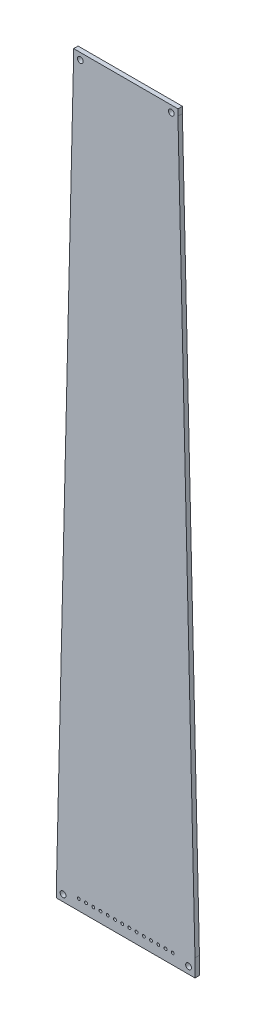
ISO-10303-21;
HEADER;
FILE_DESCRIPTION(('STEP AP214'),'2;1');
FILE_NAME('part.step','',(''),(''),'','','');
FILE_SCHEMA(('AUTOMOTIVE_DESIGN { 1 0 10303 214 1 1 1 1 }'));
ENDSEC;
DATA;
#1=APPLICATION_CONTEXT('core data for automotive mechanical design processes');
#2=APPLICATION_PROTOCOL_DEFINITION('international standard','automotive_design',2000,#1);
#3=PRODUCT_CONTEXT('',#1,'mechanical');
#4=PRODUCT('Part','Part','',(#3));
#5=PRODUCT_RELATED_PRODUCT_CATEGORY('part','',(#4));
#6=PRODUCT_DEFINITION_FORMATION('','',#4);
#7=PRODUCT_DEFINITION_CONTEXT('part definition',#1,'design');
#8=PRODUCT_DEFINITION('design','',#6,#7);
#9=PRODUCT_DEFINITION_SHAPE('','',#8);
#10=(LENGTH_UNIT() NAMED_UNIT(*) SI_UNIT(.MILLI.,.METRE.));
#11=(NAMED_UNIT(*) PLANE_ANGLE_UNIT() SI_UNIT($,.RADIAN.));
#12=(NAMED_UNIT(*) SI_UNIT($,.STERADIAN.) SOLID_ANGLE_UNIT());
#13=UNCERTAINTY_MEASURE_WITH_UNIT(LENGTH_MEASURE(1.E-05),#10,'distance_accuracy_value','');
#14=(GEOMETRIC_REPRESENTATION_CONTEXT(3) GLOBAL_UNCERTAINTY_ASSIGNED_CONTEXT((#13)) GLOBAL_UNIT_ASSIGNED_CONTEXT((#10,
#11,#12)) REPRESENTATION_CONTEXT('',''));
#15=CARTESIAN_POINT('',(0.,0.,0.));
#16=DIRECTION('',(0.,0.,1.));
#17=DIRECTION('',(1.,0.,0.));
#18=AXIS2_PLACEMENT_3D('',#15,#16,#17);
#19=CARTESIAN_POINT('',(7.307507200419E-07,-4.436456342402,1.538354076708));
#20=DIRECTION('',(0.,0.,-1.));
#21=DIRECTION('',(0.,-1.,0.));
#22=AXIS2_PLACEMENT_3D('',#19,#20,#21);
#23=PLANE('',#22);
#24=CARTESIAN_POINT('',(21.717043434087,-128.2702565405,1.538354076708));
#25=DIRECTION('',(0.,0.,1.));
#26=DIRECTION('',(1.,0.,0.));
#27=AXIS2_PLACEMENT_3D('',#24,#25,#26);
#28=CIRCLE('',#27,1.000002540005);
#29=CARTESIAN_POINT('',(22.717045974092,-128.2702565405,1.538354076708));
#30=VERTEX_POINT('',#29);
#31=EDGE_CURVE('E27',#30,#30,#28,.T.);
#32=ORIENTED_EDGE('',*,*,#31,.F.);
#33=EDGE_LOOP('',(#32));
#34=FACE_BOUND('',#33,.T.);
#35=CARTESIAN_POINT('',(16.249911099822,-127.0002286004,1.538354076708));
#36=DIRECTION('',(0.,0.,1.));
#37=DIRECTION('',(1.,0.,0.));
#38=AXIS2_PLACEMENT_3D('',#35,#36,#37);
#39=CIRCLE('',#38,0.5);
#40=CARTESIAN_POINT('',(16.749911099822,-127.0002286004,1.538354076708));
#41=VERTEX_POINT('',#40);
#42=EDGE_CURVE('E186',#41,#41,#39,.T.);
#43=ORIENTED_EDGE('',*,*,#42,.F.);
#44=EDGE_LOOP('',(#43));
#45=FACE_BOUND('',#44,.T.);
#46=CARTESIAN_POINT('',(15.748031496063,124.58724917449,1.538354076708));
#47=DIRECTION('',(0.,0.,1.));
#48=DIRECTION('',(1.,0.,0.));
#49=AXIS2_PLACEMENT_3D('',#46,#47,#48);
#50=CIRCLE('',#49,1.000002540005);
#51=CARTESIAN_POINT('',(16.748034036068,124.58724917449,1.538354076708));
#52=VERTEX_POINT('',#51);
#53=EDGE_CURVE('E187',#52,#52,#50,.T.);
#54=ORIENTED_EDGE('',*,*,#53,.F.);
#55=EDGE_LOOP('',(#54));
#56=FACE_BOUND('',#55,.T.);
#57=CARTESIAN_POINT('',(13.750038100076,-127.0002286004,1.538354076708));
#58=DIRECTION('',(0.,0.,1.));
#59=DIRECTION('',(1.,0.,0.));
#60=AXIS2_PLACEMENT_3D('',#57,#58,#59);
#61=CIRCLE('',#60,0.5);
#62=CARTESIAN_POINT('',(14.250038100076,-127.0002286004,1.538354076708));
#63=VERTEX_POINT('',#62);
#64=EDGE_CURVE('E270',#63,#63,#61,.T.);
#65=ORIENTED_EDGE('',*,*,#64,.F.);
#66=EDGE_LOOP('',(#65));
#67=FACE_BOUND('',#66,.T.);
#68=CARTESIAN_POINT('',(11.250038100076,-127.0002286004,1.538354076708));
#69=DIRECTION('',(0.,0.,1.));
#70=DIRECTION('',(1.,0.,0.));
#71=AXIS2_PLACEMENT_3D('',#68,#69,#70);
#72=CIRCLE('',#71,0.5);
#73=CARTESIAN_POINT('',(11.750038100076,-127.0002286004,1.538354076708));
#74=VERTEX_POINT('',#73);
#75=EDGE_CURVE('E333',#74,#74,#72,.T.);
#76=ORIENTED_EDGE('',*,*,#75,.F.);
#77=EDGE_LOOP('',(#76));
#78=FACE_BOUND('',#77,.T.);
#79=CARTESIAN_POINT('',(8.750038100076,-127.0002286004,1.538354076708));
#80=DIRECTION('',(0.,0.,1.));
#81=DIRECTION('',(1.,0.,0.));
#82=AXIS2_PLACEMENT_3D('',#79,#80,#81);
#83=CIRCLE('',#82,0.5);
#84=CARTESIAN_POINT('',(9.250038100076,-127.0002286004,1.538354076708));
#85=VERTEX_POINT('',#84);
#86=EDGE_CURVE('E325',#85,#85,#83,.T.);
#87=ORIENTED_EDGE('',*,*,#86,.F.);
#88=EDGE_LOOP('',(#87));
#89=FACE_BOUND('',#88,.T.);
#90=CARTESIAN_POINT('',(6.250038100076,-127.0002286004,1.538354076708));
#91=DIRECTION('',(0.,0.,1.));
#92=DIRECTION('',(1.,0.,0.));
#93=AXIS2_PLACEMENT_3D('',#90,#91,#92);
#94=CIRCLE('',#93,0.5);
#95=CARTESIAN_POINT('',(6.750038100076,-127.0002286004,1.538354076708));
#96=VERTEX_POINT('',#95);
#97=EDGE_CURVE('E317',#96,#96,#94,.T.);
#98=ORIENTED_EDGE('',*,*,#97,.F.);
#99=EDGE_LOOP('',(#98));
#100=FACE_BOUND('',#99,.T.);
#101=CARTESIAN_POINT('',(3.750038100076,-127.0002286004,1.538354076708));
#102=DIRECTION('',(0.,0.,1.));
#103=DIRECTION('',(1.,0.,0.));
#104=AXIS2_PLACEMENT_3D('',#101,#102,#103);
#105=CIRCLE('',#104,0.5);
#106=CARTESIAN_POINT('',(4.250038100076,-127.0002286004,1.538354076708));
#107=VERTEX_POINT('',#106);
#108=EDGE_CURVE('E309',#107,#107,#105,.T.);
#109=ORIENTED_EDGE('',*,*,#108,.F.);
#110=EDGE_LOOP('',(#109));
#111=FACE_BOUND('',#110,.T.);
#112=CARTESIAN_POINT('',(1.250038100076,-127.0002286004,1.538354076708));
#113=DIRECTION('',(0.,0.,1.));
#114=DIRECTION('',(1.,0.,0.));
#115=AXIS2_PLACEMENT_3D('',#112,#113,#114);
#116=CIRCLE('',#115,0.5);
#117=CARTESIAN_POINT('',(1.750038100076,-127.0002286004,1.538354076708));
#118=VERTEX_POINT('',#117);
#119=EDGE_CURVE('E298',#118,#118,#116,.T.);
#120=ORIENTED_EDGE('',*,*,#119,.F.);
#121=EDGE_LOOP('',(#120));
#122=FACE_BOUND('',#121,.T.);
#123=CARTESIAN_POINT('',(-1.249961899924,-127.0002286004,1.538354076708));
#124=DIRECTION('',(0.,0.,1.));
#125=DIRECTION('',(1.,0.,0.));
#126=AXIS2_PLACEMENT_3D('',#123,#124,#125);
#127=CIRCLE('',#126,0.5);
#128=CARTESIAN_POINT('',(-0.749961899924,-127.0002286004,1.538354076708));
#129=VERTEX_POINT('',#128);
#130=EDGE_CURVE('E262',#129,#129,#127,.T.);
#131=ORIENTED_EDGE('',*,*,#130,.F.);
#132=EDGE_LOOP('',(#131));
#133=FACE_BOUND('',#132,.T.);
#134=CARTESIAN_POINT('',(-3.749961899924,-127.0002286004,1.538354076708));
#135=DIRECTION('',(0.,0.,1.));
#136=DIRECTION('',(1.,0.,0.));
#137=AXIS2_PLACEMENT_3D('',#134,#135,#136);
#138=CIRCLE('',#137,0.5);
#139=CARTESIAN_POINT('',(-3.249961899924,-127.0002286004,1.538354076708));
#140=VERTEX_POINT('',#139);
#141=EDGE_CURVE('E263',#140,#140,#138,.T.);
#142=ORIENTED_EDGE('',*,*,#141,.F.);
#143=EDGE_LOOP('',(#142));
#144=FACE_BOUND('',#143,.T.);
#145=CARTESIAN_POINT('',(-6.249961899924,-127.0002286004,1.538354076708));
#146=DIRECTION('',(0.,0.,1.));
#147=DIRECTION('',(1.,0.,0.));
#148=AXIS2_PLACEMENT_3D('',#145,#146,#147);
#149=CIRCLE('',#148,0.5);
#150=CARTESIAN_POINT('',(-5.749961899924,-127.0002286004,1.538354076708));
#151=VERTEX_POINT('',#150);
#152=EDGE_CURVE('E240',#151,#151,#149,.T.);
#153=ORIENTED_EDGE('',*,*,#152,.F.);
#154=EDGE_LOOP('',(#153));
#155=FACE_BOUND('',#154,.T.);
#156=CARTESIAN_POINT('',(-8.749961899924,-127.0002286004,1.538354076708));
#157=DIRECTION('',(0.,0.,1.));
#158=DIRECTION('',(1.,0.,0.));
#159=AXIS2_PLACEMENT_3D('',#156,#157,#158);
#160=CIRCLE('',#159,0.5);
#161=CARTESIAN_POINT('',(-8.249961899924,-127.0002286004,1.538354076708));
#162=VERTEX_POINT('',#161);
#163=EDGE_CURVE('E204',#162,#162,#160,.T.);
#164=ORIENTED_EDGE('',*,*,#163,.F.);
#165=EDGE_LOOP('',(#164));
#166=FACE_BOUND('',#165,.T.);
#167=CARTESIAN_POINT('',(-11.24996189992,-127.0002286004,1.538354076708));
#168=DIRECTION('',(0.,0.,1.));
#169=DIRECTION('',(1.,0.,0.));
#170=AXIS2_PLACEMENT_3D('',#167,#168,#169);
#171=CIRCLE('',#170,0.5);
#172=CARTESIAN_POINT('',(-10.74996189992,-127.0002286004,1.538354076708));
#173=VERTEX_POINT('',#172);
#174=EDGE_CURVE('E171',#173,#173,#171,.T.);
#175=ORIENTED_EDGE('',*,*,#174,.F.);
#176=EDGE_LOOP('',(#175));
#177=FACE_BOUND('',#176,.T.);
#178=CARTESIAN_POINT('',(-13.74996189992,-127.0002286004,1.538354076708));
#179=DIRECTION('',(0.,0.,1.));
#180=DIRECTION('',(1.,0.,0.));
#181=AXIS2_PLACEMENT_3D('',#178,#179,#180);
#182=CIRCLE('',#181,0.5);
#183=CARTESIAN_POINT('',(-13.24996189992,-127.0002286004,1.538354076708));
#184=VERTEX_POINT('',#183);
#185=EDGE_CURVE('E193',#184,#184,#182,.T.);
#186=ORIENTED_EDGE('',*,*,#185,.F.);
#187=EDGE_LOOP('',(#186));
#188=FACE_BOUND('',#187,.T.);
#189=CARTESIAN_POINT('',(-15.74803149606,124.58724917449,1.538354076708));
#190=DIRECTION('',(0.,0.,1.));
#191=DIRECTION('',(1.,0.,0.));
#192=AXIS2_PLACEMENT_3D('',#189,#190,#191);
#193=CIRCLE('',#192,1.000002540005);
#194=CARTESIAN_POINT('',(-14.748028956055,124.58724917449,1.538354076708));
#195=VERTEX_POINT('',#194);
#196=EDGE_CURVE('E245',#195,#195,#193,.T.);
#197=ORIENTED_EDGE('',*,*,#196,.F.);
#198=EDGE_LOOP('',(#197));
#199=FACE_BOUND('',#198,.T.);
#200=CARTESIAN_POINT('',(-16.24996189992,-127.0002286004,1.538354076708));
#201=DIRECTION('',(0.,0.,1.));
#202=DIRECTION('',(1.,0.,0.));
#203=AXIS2_PLACEMENT_3D('',#200,#201,#202);
#204=CIRCLE('',#203,0.5);
#205=CARTESIAN_POINT('',(-15.74996189992,-127.0002286004,1.538354076708));
#206=VERTEX_POINT('',#205);
#207=EDGE_CURVE('E253',#206,#206,#204,.T.);
#208=ORIENTED_EDGE('',*,*,#207,.F.);
#209=EDGE_LOOP('',(#208));
#210=FACE_BOUND('',#209,.T.);
#211=CARTESIAN_POINT('',(-21.71704343408,-128.3972567945,1.538354076708));
#212=DIRECTION('',(0.,0.,1.));
#213=DIRECTION('',(1.,0.,0.));
#214=AXIS2_PLACEMENT_3D('',#211,#212,#213);
#215=CIRCLE('',#214,1.000002540005);
#216=CARTESIAN_POINT('',(-20.717040894075,-128.3972567945,1.538354076708));
#217=VERTEX_POINT('',#216);
#218=EDGE_CURVE('E133',#217,#217,#215,.T.);
#219=ORIENTED_EDGE('',*,*,#218,.F.);
#220=EDGE_LOOP('',(#219));
#221=FACE_BOUND('',#220,.T.);
#222=DIRECTION('',(1.60324000959454E-06,0.999999999998715,0.));
#223=VECTOR('',#222,1.);
#224=CARTESIAN_POINT('',(-18.05206348825,124.64994890629,1.538354076708));
#225=LINE('',#224,#223);
#226=CARTESIAN_POINT('',(-18.05206348825,124.64994890629,1.538354076708));
#227=VERTEX_POINT('',#226);
#228=CARTESIAN_POINT('',(-18.05205994412,126.8605537211,1.538354076708));
#229=VERTEX_POINT('',#228);
#230=EDGE_CURVE('E134',#227,#229,#225,.T.);
#231=ORIENTED_EDGE('',*,*,#230,.F.);
#232=DIRECTION('',(0.0236231185664704,0.999720935196015,0.));
#233=VECTOR('',#232,1.);
#234=CARTESIAN_POINT('',(-23.94295910591,-124.6503989485,1.538354076708));
#235=LINE('',#234,#233);
#236=CARTESIAN_POINT('',(-23.94295910591,-124.6503989485,1.538354076708));
#237=VERTEX_POINT('',#236);
#238=EDGE_CURVE('E222',#237,#227,#235,.T.);
#239=ORIENTED_EDGE('',*,*,#238,.F.);
#240=DIRECTION('',(0.,1.,0.));
#241=VECTOR('',#240,1.);
#242=CARTESIAN_POINT('',(-23.94295910591,-130.6705613411,1.538354076708));
#243=LINE('',#242,#241);
#244=CARTESIAN_POINT('',(-23.94295910591,-130.6705613411,1.538354076708));
#245=VERTEX_POINT('',#244);
#246=EDGE_CURVE('E78',#245,#237,#243,.T.);
#247=ORIENTED_EDGE('',*,*,#246,.F.);
#248=DIRECTION('',(-1.,0.,0.));
#249=VECTOR('',#248,1.);
#250=CARTESIAN_POINT('',(23.942959105918,-130.6705613411,1.538354076708));
#251=LINE('',#250,#249);
#252=CARTESIAN_POINT('',(23.942959105918,-130.6705613411,1.538354076708));
#253=VERTEX_POINT('',#252);
#254=EDGE_CURVE('E190',#253,#245,#251,.T.);
#255=ORIENTED_EDGE('',*,*,#254,.F.);
#256=DIRECTION('',(0.,-1.,0.));
#257=VECTOR('',#256,1.);
#258=CARTESIAN_POINT('',(23.942959105918,-124.6503989485,1.538354076708));
#259=LINE('',#258,#257);
#260=CARTESIAN_POINT('',(23.942959105918,-124.6503989485,1.538354076708));
#261=VERTEX_POINT('',#260);
#262=EDGE_CURVE('E89',#261,#253,#259,.T.);
#263=ORIENTED_EDGE('',*,*,#262,.F.);
#264=DIRECTION('',(0.0236231043581142,-0.999720935531754,0.));
#265=VECTOR('',#264,1.);
#266=CARTESIAN_POINT('',(18.05205994412,124.65024892049,1.538354076708));
#267=LINE('',#266,#265);
#268=CARTESIAN_POINT('',(18.05205994412,124.65024892049,1.538354076708));
#269=VERTEX_POINT('',#268);
#270=EDGE_CURVE('E107',#269,#261,#267,.T.);
#271=ORIENTED_EDGE('',*,*,#270,.F.);
#272=DIRECTION('',(0.,-1.,0.));
#273=VECTOR('',#272,1.);
#274=CARTESIAN_POINT('',(18.05205994412,126.8605537211,1.538354076708));
#275=LINE('',#274,#273);
#276=CARTESIAN_POINT('',(18.05205994412,126.8605537211,1.538354076708));
#277=VERTEX_POINT('',#276);
#278=EDGE_CURVE('E144',#277,#269,#275,.T.);
#279=ORIENTED_EDGE('',*,*,#278,.F.);
#280=DIRECTION('',(1.,0.,0.));
#281=VECTOR('',#280,1.);
#282=CARTESIAN_POINT('',(-18.05205994412,126.8605537211,1.538354076708));
#283=LINE('',#282,#281);
#284=EDGE_CURVE('E149',#229,#277,#283,.T.);
#285=ORIENTED_EDGE('',*,*,#284,.F.);
#286=EDGE_LOOP('',(#231,#239,#247,#255,#263,#271,#279,#285));
#287=FACE_BOUND('',#286,.T.);
#288=ADVANCED_FACE('F17',(#34,#45,#56,#67,#78,#89,#100,#111,#122,#133,#144,#155,#166,#177,#188,
#199,#210,#221,#287),#23,.F.);
#289=CARTESIAN_POINT('',(7.307507200419E-07,-4.436456342402,0.));
#290=DIRECTION('',(0.,0.,-1.));
#291=DIRECTION('',(0.,-1.,0.));
#292=AXIS2_PLACEMENT_3D('',#289,#290,#291);
#293=PLANE('',#292);
#294=CARTESIAN_POINT('',(21.717043434087,-128.2702565405,0.));
#295=DIRECTION('',(0.,0.,1.));
#296=DIRECTION('',(1.,0.,0.));
#297=AXIS2_PLACEMENT_3D('',#294,#295,#296);
#298=CIRCLE('',#297,1.000002540005);
#299=CARTESIAN_POINT('',(22.717045974092,-128.2702565405,0.));
#300=VERTEX_POINT('',#299);
#301=EDGE_CURVE('E10',#300,#300,#298,.T.);
#302=ORIENTED_EDGE('',*,*,#301,.T.);
#303=EDGE_LOOP('',(#302));
#304=FACE_BOUND('',#303,.T.);
#305=CARTESIAN_POINT('',(16.249911099822,-127.0002286004,0.));
#306=DIRECTION('',(0.,0.,1.));
#307=DIRECTION('',(1.,0.,0.));
#308=AXIS2_PLACEMENT_3D('',#305,#306,#307);
#309=CIRCLE('',#308,0.5);
#310=CARTESIAN_POINT('',(16.749911099822,-127.0002286004,0.));
#311=VERTEX_POINT('',#310);
#312=EDGE_CURVE('E20',#311,#311,#309,.T.);
#313=ORIENTED_EDGE('',*,*,#312,.T.);
#314=EDGE_LOOP('',(#313));
#315=FACE_BOUND('',#314,.T.);
#316=CARTESIAN_POINT('',(15.748031496063,124.58724917449,0.));
#317=DIRECTION('',(0.,0.,1.));
#318=DIRECTION('',(1.,0.,0.));
#319=AXIS2_PLACEMENT_3D('',#316,#317,#318);
#320=CIRCLE('',#319,1.000002540005);
#321=CARTESIAN_POINT('',(16.748034036068,124.58724917449,0.));
#322=VERTEX_POINT('',#321);
#323=EDGE_CURVE('E182',#322,#322,#320,.T.);
#324=ORIENTED_EDGE('',*,*,#323,.T.);
#325=EDGE_LOOP('',(#324));
#326=FACE_BOUND('',#325,.T.);
#327=CARTESIAN_POINT('',(13.750038100076,-127.0002286004,0.));
#328=DIRECTION('',(0.,0.,1.));
#329=DIRECTION('',(1.,0.,0.));
#330=AXIS2_PLACEMENT_3D('',#327,#328,#329);
#331=CIRCLE('',#330,0.5);
#332=CARTESIAN_POINT('',(14.250038100076,-127.0002286004,0.));
#333=VERTEX_POINT('',#332);
#334=EDGE_CURVE('E225',#333,#333,#331,.T.);
#335=ORIENTED_EDGE('',*,*,#334,.T.);
#336=EDGE_LOOP('',(#335));
#337=FACE_BOUND('',#336,.T.);
#338=CARTESIAN_POINT('',(11.250038100076,-127.0002286004,0.));
#339=DIRECTION('',(0.,0.,1.));
#340=DIRECTION('',(1.,0.,0.));
#341=AXIS2_PLACEMENT_3D('',#338,#339,#340);
#342=CIRCLE('',#341,0.5);
#343=CARTESIAN_POINT('',(11.750038100076,-127.0002286004,0.));
#344=VERTEX_POINT('',#343);
#345=EDGE_CURVE('E274',#344,#344,#342,.T.);
#346=ORIENTED_EDGE('',*,*,#345,.T.);
#347=EDGE_LOOP('',(#346));
#348=FACE_BOUND('',#347,.T.);
#349=CARTESIAN_POINT('',(8.750038100076,-127.0002286004,0.));
#350=DIRECTION('',(0.,0.,1.));
#351=DIRECTION('',(1.,0.,0.));
#352=AXIS2_PLACEMENT_3D('',#349,#350,#351);
#353=CIRCLE('',#352,0.5);
#354=CARTESIAN_POINT('',(9.250038100076,-127.0002286004,0.));
#355=VERTEX_POINT('',#354);
#356=EDGE_CURVE('E329',#355,#355,#353,.T.);
#357=ORIENTED_EDGE('',*,*,#356,.T.);
#358=EDGE_LOOP('',(#357));
#359=FACE_BOUND('',#358,.T.);
#360=CARTESIAN_POINT('',(6.250038100076,-127.0002286004,0.));
#361=DIRECTION('',(0.,0.,1.));
#362=DIRECTION('',(1.,0.,0.));
#363=AXIS2_PLACEMENT_3D('',#360,#361,#362);
#364=CIRCLE('',#363,0.5);
#365=CARTESIAN_POINT('',(6.750038100076,-127.0002286004,0.));
#366=VERTEX_POINT('',#365);
#367=EDGE_CURVE('E321',#366,#366,#364,.T.);
#368=ORIENTED_EDGE('',*,*,#367,.T.);
#369=EDGE_LOOP('',(#368));
#370=FACE_BOUND('',#369,.T.);
#371=CARTESIAN_POINT('',(3.750038100076,-127.0002286004,0.));
#372=DIRECTION('',(0.,0.,1.));
#373=DIRECTION('',(1.,0.,0.));
#374=AXIS2_PLACEMENT_3D('',#371,#372,#373);
#375=CIRCLE('',#374,0.5);
#376=CARTESIAN_POINT('',(4.250038100076,-127.0002286004,0.));
#377=VERTEX_POINT('',#376);
#378=EDGE_CURVE('E313',#377,#377,#375,.T.);
#379=ORIENTED_EDGE('',*,*,#378,.T.);
#380=EDGE_LOOP('',(#379));
#381=FACE_BOUND('',#380,.T.);
#382=CARTESIAN_POINT('',(1.250038100076,-127.0002286004,0.));
#383=DIRECTION('',(0.,0.,1.));
#384=DIRECTION('',(1.,0.,0.));
#385=AXIS2_PLACEMENT_3D('',#382,#383,#384);
#386=CIRCLE('',#385,0.5);
#387=CARTESIAN_POINT('',(1.750038100076,-127.0002286004,0.));
#388=VERTEX_POINT('',#387);
#389=EDGE_CURVE('E305',#388,#388,#386,.T.);
#390=ORIENTED_EDGE('',*,*,#389,.T.);
#391=EDGE_LOOP('',(#390));
#392=FACE_BOUND('',#391,.T.);
#393=CARTESIAN_POINT('',(-1.249961899924,-127.0002286004,0.));
#394=DIRECTION('',(0.,0.,1.));
#395=DIRECTION('',(1.,0.,0.));
#396=AXIS2_PLACEMENT_3D('',#393,#394,#395);
#397=CIRCLE('',#396,0.5);
#398=CARTESIAN_POINT('',(-0.749961899924,-127.0002286004,0.));
#399=VERTEX_POINT('',#398);
#400=EDGE_CURVE('E281',#399,#399,#397,.T.);
#401=ORIENTED_EDGE('',*,*,#400,.T.);
#402=EDGE_LOOP('',(#401));
#403=FACE_BOUND('',#402,.T.);
#404=CARTESIAN_POINT('',(-3.749961899924,-127.0002286004,0.));
#405=DIRECTION('',(0.,0.,1.));
#406=DIRECTION('',(1.,0.,0.));
#407=AXIS2_PLACEMENT_3D('',#404,#405,#406);
#408=CIRCLE('',#407,0.5);
#409=CARTESIAN_POINT('',(-3.249961899924,-127.0002286004,0.));
#410=VERTEX_POINT('',#409);
#411=EDGE_CURVE('E258',#410,#410,#408,.T.);
#412=ORIENTED_EDGE('',*,*,#411,.T.);
#413=EDGE_LOOP('',(#412));
#414=FACE_BOUND('',#413,.T.);
#415=CARTESIAN_POINT('',(-6.249961899924,-127.0002286004,0.));
#416=DIRECTION('',(0.,0.,1.));
#417=DIRECTION('',(1.,0.,0.));
#418=AXIS2_PLACEMENT_3D('',#415,#416,#417);
#419=CIRCLE('',#418,0.5);
#420=CARTESIAN_POINT('',(-5.749961899924,-127.0002286004,0.));
#421=VERTEX_POINT('',#420);
#422=EDGE_CURVE('E288',#421,#421,#419,.T.);
#423=ORIENTED_EDGE('',*,*,#422,.T.);
#424=EDGE_LOOP('',(#423));
#425=FACE_BOUND('',#424,.T.);
#426=CARTESIAN_POINT('',(-8.749961899924,-127.0002286004,0.));
#427=DIRECTION('',(0.,0.,1.));
#428=DIRECTION('',(1.,0.,0.));
#429=AXIS2_PLACEMENT_3D('',#426,#427,#428);
#430=CIRCLE('',#429,0.5);
#431=CARTESIAN_POINT('',(-8.249961899924,-127.0002286004,0.));
#432=VERTEX_POINT('',#431);
#433=EDGE_CURVE('E237',#432,#432,#430,.T.);
#434=ORIENTED_EDGE('',*,*,#433,.T.);
#435=EDGE_LOOP('',(#434));
#436=FACE_BOUND('',#435,.T.);
#437=CARTESIAN_POINT('',(-11.24996189992,-127.0002286004,0.));
#438=DIRECTION('',(0.,0.,1.));
#439=DIRECTION('',(1.,0.,0.));
#440=AXIS2_PLACEMENT_3D('',#437,#438,#439);
#441=CIRCLE('',#440,0.5);
#442=CARTESIAN_POINT('',(-10.74996189992,-127.0002286004,0.));
#443=VERTEX_POINT('',#442);
#444=EDGE_CURVE('E175',#443,#443,#441,.T.);
#445=ORIENTED_EDGE('',*,*,#444,.T.);
#446=EDGE_LOOP('',(#445));
#447=FACE_BOUND('',#446,.T.);
#448=CARTESIAN_POINT('',(-13.74996189992,-127.0002286004,0.));
#449=DIRECTION('',(0.,0.,1.));
#450=DIRECTION('',(1.,0.,0.));
#451=AXIS2_PLACEMENT_3D('',#448,#449,#450);
#452=CIRCLE('',#451,0.5);
#453=CARTESIAN_POINT('',(-13.24996189992,-127.0002286004,0.));
#454=VERTEX_POINT('',#453);
#455=EDGE_CURVE('E176',#454,#454,#452,.T.);
#456=ORIENTED_EDGE('',*,*,#455,.T.);
#457=EDGE_LOOP('',(#456));
#458=FACE_BOUND('',#457,.T.);
#459=CARTESIAN_POINT('',(-15.74803149606,124.58724917449,0.));
#460=DIRECTION('',(0.,0.,1.));
#461=DIRECTION('',(1.,0.,0.));
#462=AXIS2_PLACEMENT_3D('',#459,#460,#461);
#463=CIRCLE('',#462,1.000002540005);
#464=CARTESIAN_POINT('',(-14.748028956055,124.58724917449,0.));
#465=VERTEX_POINT('',#464);
#466=EDGE_CURVE('E197',#465,#465,#463,.T.);
#467=ORIENTED_EDGE('',*,*,#466,.T.);
#468=EDGE_LOOP('',(#467));
#469=FACE_BOUND('',#468,.T.);
#470=CARTESIAN_POINT('',(-16.24996189992,-127.0002286004,0.));
#471=DIRECTION('',(0.,0.,1.));
#472=DIRECTION('',(1.,0.,0.));
#473=AXIS2_PLACEMENT_3D('',#470,#471,#472);
#474=CIRCLE('',#473,0.5);
#475=CARTESIAN_POINT('',(-15.74996189992,-127.0002286004,0.));
#476=VERTEX_POINT('',#475);
#477=EDGE_CURVE('E257',#476,#476,#474,.T.);
#478=ORIENTED_EDGE('',*,*,#477,.T.);
#479=EDGE_LOOP('',(#478));
#480=FACE_BOUND('',#479,.T.);
#481=CARTESIAN_POINT('',(-21.71704343408,-128.3972567945,0.));
#482=DIRECTION('',(0.,0.,1.));
#483=DIRECTION('',(1.,0.,0.));
#484=AXIS2_PLACEMENT_3D('',#481,#482,#483);
#485=CIRCLE('',#484,1.000002540005);
#486=CARTESIAN_POINT('',(-20.717040894075,-128.3972567945,0.));
#487=VERTEX_POINT('',#486);
#488=EDGE_CURVE('E249',#487,#487,#485,.T.);
#489=ORIENTED_EDGE('',*,*,#488,.T.);
#490=EDGE_LOOP('',(#489));
#491=FACE_BOUND('',#490,.T.);
#492=DIRECTION('',(1.,0.,0.));
#493=VECTOR('',#492,1.);
#494=CARTESIAN_POINT('',(-18.05205994412,126.8605537211,0.));
#495=LINE('',#494,#493);
#496=CARTESIAN_POINT('',(-18.05205994412,126.8605537211,0.));
#497=VERTEX_POINT('',#496);
#498=CARTESIAN_POINT('',(18.05205994412,126.8605537211,0.));
#499=VERTEX_POINT('',#498);
#500=EDGE_CURVE('E127',#497,#499,#495,.T.);
#501=ORIENTED_EDGE('',*,*,#500,.T.);
#502=DIRECTION('',(0.,-1.,0.));
#503=VECTOR('',#502,1.);
#504=CARTESIAN_POINT('',(18.05205994412,126.8605537211,0.));
#505=LINE('',#504,#503);
#506=CARTESIAN_POINT('',(18.05205994412,124.65024892049,0.));
#507=VERTEX_POINT('',#506);
#508=EDGE_CURVE('E165',#499,#507,#505,.T.);
#509=ORIENTED_EDGE('',*,*,#508,.T.);
#510=DIRECTION('',(0.0236231043581142,-0.999720935531754,0.));
#511=VECTOR('',#510,1.);
#512=CARTESIAN_POINT('',(18.05205994412,124.65024892049,0.));
#513=LINE('',#512,#511);
#514=CARTESIAN_POINT('',(23.942959105918,-124.6503989485,0.));
#515=VERTEX_POINT('',#514);
#516=EDGE_CURVE('E100',#507,#515,#513,.T.);
#517=ORIENTED_EDGE('',*,*,#516,.T.);
#518=DIRECTION('',(0.,-1.,0.));
#519=VECTOR('',#518,1.);
#520=CARTESIAN_POINT('',(23.942959105918,-124.6503989485,0.));
#521=LINE('',#520,#519);
#522=CARTESIAN_POINT('',(23.942959105918,-130.6705613411,0.));
#523=VERTEX_POINT('',#522);
#524=EDGE_CURVE('E208',#515,#523,#521,.T.);
#525=ORIENTED_EDGE('',*,*,#524,.T.);
#526=DIRECTION('',(-1.,0.,0.));
#527=VECTOR('',#526,1.);
#528=CARTESIAN_POINT('',(23.942959105918,-130.6705613411,0.));
#529=LINE('',#528,#527);
#530=CARTESIAN_POINT('',(-23.94295910591,-130.6705613411,0.));
#531=VERTEX_POINT('',#530);
#532=EDGE_CURVE('E67',#523,#531,#529,.T.);
#533=ORIENTED_EDGE('',*,*,#532,.T.);
#534=DIRECTION('',(0.,1.,0.));
#535=VECTOR('',#534,1.);
#536=CARTESIAN_POINT('',(-23.94295910591,-130.6705613411,0.));
#537=LINE('',#536,#535);
#538=CARTESIAN_POINT('',(-23.94295910591,-124.6503989485,0.));
#539=VERTEX_POINT('',#538);
#540=EDGE_CURVE('E219',#531,#539,#537,.T.);
#541=ORIENTED_EDGE('',*,*,#540,.T.);
#542=DIRECTION('',(0.0236231185664704,0.999720935196015,0.));
#543=VECTOR('',#542,1.);
#544=CARTESIAN_POINT('',(-23.94295910591,-124.6503989485,0.));
#545=LINE('',#544,#543);
#546=CARTESIAN_POINT('',(-18.05206348825,124.64994890629,0.));
#547=VERTEX_POINT('',#546);
#548=EDGE_CURVE('E130',#539,#547,#545,.T.);
#549=ORIENTED_EDGE('',*,*,#548,.T.);
#550=DIRECTION('',(1.60324000959454E-06,0.999999999998715,0.));
#551=VECTOR('',#550,1.);
#552=CARTESIAN_POINT('',(-18.05206348825,124.64994890629,0.));
#553=LINE('',#552,#551);
#554=EDGE_CURVE('E41',#547,#497,#553,.T.);
#555=ORIENTED_EDGE('',*,*,#554,.T.);
#556=EDGE_LOOP('',(#501,#509,#517,#525,#533,#541,#549,#555));
#557=FACE_BOUND('',#556,.T.);
#558=ADVANCED_FACE('F126',(#304,#315,#326,#337,#348,#359,#370,#381,#392,#403,#414,#425,#436,
#447,#458,#469,#480,#491,#557),#293,.T.);
#559=CARTESIAN_POINT('',(21.717043434087,-128.2702565405,0.));
#560=DIRECTION('',(0.,0.,-1.));
#561=DIRECTION('',(1.,0.,0.));
#562=AXIS2_PLACEMENT_3D('',#559,#560,#561);
#563=CYLINDRICAL_SURFACE('',#562,1.000002540005);
#564=ORIENTED_EDGE('',*,*,#31,.T.);
#565=EDGE_LOOP('',(#564));
#566=FACE_BOUND('',#565,.T.);
#567=ORIENTED_EDGE('',*,*,#301,.F.);
#568=EDGE_LOOP('',(#567));
#569=FACE_BOUND('',#568,.T.);
#570=ADVANCED_FACE('F359',(#566,#569),#563,.F.);
#571=CARTESIAN_POINT('',(16.249911099822,-127.0002286004,0.));
#572=DIRECTION('',(0.,0.,-1.));
#573=DIRECTION('',(1.,0.,0.));
#574=AXIS2_PLACEMENT_3D('',#571,#572,#573);
#575=CYLINDRICAL_SURFACE('',#574,0.5);
#576=ORIENTED_EDGE('',*,*,#42,.T.);
#577=EDGE_LOOP('',(#576));
#578=FACE_BOUND('',#577,.T.);
#579=ORIENTED_EDGE('',*,*,#312,.F.);
#580=EDGE_LOOP('',(#579));
#581=FACE_BOUND('',#580,.T.);
#582=ADVANCED_FACE('F356',(#578,#581),#575,.F.);
#583=CARTESIAN_POINT('',(15.748031496063,124.58724917449,0.));
#584=DIRECTION('',(0.,0.,-1.));
#585=DIRECTION('',(1.,0.,0.));
#586=AXIS2_PLACEMENT_3D('',#583,#584,#585);
#587=CYLINDRICAL_SURFACE('',#586,1.000002540005);
#588=ORIENTED_EDGE('',*,*,#53,.T.);
#589=EDGE_LOOP('',(#588));
#590=FACE_BOUND('',#589,.T.);
#591=ORIENTED_EDGE('',*,*,#323,.F.);
#592=EDGE_LOOP('',(#591));
#593=FACE_BOUND('',#592,.T.);
#594=ADVANCED_FACE('F358',(#590,#593),#587,.F.);
#595=CARTESIAN_POINT('',(13.750038100076,-127.0002286004,0.));
#596=DIRECTION('',(0.,0.,-1.));
#597=DIRECTION('',(1.,0.,0.));
#598=AXIS2_PLACEMENT_3D('',#595,#596,#597);
#599=CYLINDRICAL_SURFACE('',#598,0.5);
#600=ORIENTED_EDGE('',*,*,#64,.T.);
#601=EDGE_LOOP('',(#600));
#602=FACE_BOUND('',#601,.T.);
#603=ORIENTED_EDGE('',*,*,#334,.F.);
#604=EDGE_LOOP('',(#603));
#605=FACE_BOUND('',#604,.T.);
#606=ADVANCED_FACE('F365',(#602,#605),#599,.F.);
#607=CARTESIAN_POINT('',(11.250038100076,-127.0002286004,0.));
#608=DIRECTION('',(0.,0.,-1.));
#609=DIRECTION('',(1.,0.,0.));
#610=AXIS2_PLACEMENT_3D('',#607,#608,#609);
#611=CYLINDRICAL_SURFACE('',#610,0.5);
#612=ORIENTED_EDGE('',*,*,#75,.T.);
#613=EDGE_LOOP('',(#612));
#614=FACE_BOUND('',#613,.T.);
#615=ORIENTED_EDGE('',*,*,#345,.F.);
#616=EDGE_LOOP('',(#615));
#617=FACE_BOUND('',#616,.T.);
#618=ADVANCED_FACE('F495',(#614,#617),#611,.F.);
#619=CARTESIAN_POINT('',(8.750038100076,-127.0002286004,0.));
#620=DIRECTION('',(0.,0.,-1.));
#621=DIRECTION('',(1.,0.,0.));
#622=AXIS2_PLACEMENT_3D('',#619,#620,#621);
#623=CYLINDRICAL_SURFACE('',#622,0.5);
#624=ORIENTED_EDGE('',*,*,#86,.T.);
#625=EDGE_LOOP('',(#624));
#626=FACE_BOUND('',#625,.T.);
#627=ORIENTED_EDGE('',*,*,#356,.F.);
#628=EDGE_LOOP('',(#627));
#629=FACE_BOUND('',#628,.T.);
#630=ADVANCED_FACE('F491',(#626,#629),#623,.F.);
#631=CARTESIAN_POINT('',(6.250038100076,-127.0002286004,0.));
#632=DIRECTION('',(0.,0.,-1.));
#633=DIRECTION('',(1.,0.,0.));
#634=AXIS2_PLACEMENT_3D('',#631,#632,#633);
#635=CYLINDRICAL_SURFACE('',#634,0.5);
#636=ORIENTED_EDGE('',*,*,#97,.T.);
#637=EDGE_LOOP('',(#636));
#638=FACE_BOUND('',#637,.T.);
#639=ORIENTED_EDGE('',*,*,#367,.F.);
#640=EDGE_LOOP('',(#639));
#641=FACE_BOUND('',#640,.T.);
#642=ADVANCED_FACE('F437',(#638,#641),#635,.F.);
#643=CARTESIAN_POINT('',(3.750038100076,-127.0002286004,0.));
#644=DIRECTION('',(0.,0.,-1.));
#645=DIRECTION('',(1.,0.,0.));
#646=AXIS2_PLACEMENT_3D('',#643,#644,#645);
#647=CYLINDRICAL_SURFACE('',#646,0.5);
#648=ORIENTED_EDGE('',*,*,#108,.T.);
#649=EDGE_LOOP('',(#648));
#650=FACE_BOUND('',#649,.T.);
#651=ORIENTED_EDGE('',*,*,#378,.F.);
#652=EDGE_LOOP('',(#651));
#653=FACE_BOUND('',#652,.T.);
#654=ADVANCED_FACE('F434',(#650,#653),#647,.F.);
#655=CARTESIAN_POINT('',(1.250038100076,-127.0002286004,0.));
#656=DIRECTION('',(0.,0.,-1.));
#657=DIRECTION('',(1.,0.,0.));
#658=AXIS2_PLACEMENT_3D('',#655,#656,#657);
#659=CYLINDRICAL_SURFACE('',#658,0.5);
#660=ORIENTED_EDGE('',*,*,#119,.T.);
#661=EDGE_LOOP('',(#660));
#662=FACE_BOUND('',#661,.T.);
#663=ORIENTED_EDGE('',*,*,#389,.F.);
#664=EDGE_LOOP('',(#663));
#665=FACE_BOUND('',#664,.T.);
#666=ADVANCED_FACE('F436',(#662,#665),#659,.F.);
#667=CARTESIAN_POINT('',(-1.249961899924,-127.0002286004,0.));
#668=DIRECTION('',(0.,0.,-1.));
#669=DIRECTION('',(1.,0.,0.));
#670=AXIS2_PLACEMENT_3D('',#667,#668,#669);
#671=CYLINDRICAL_SURFACE('',#670,0.5);
#672=ORIENTED_EDGE('',*,*,#130,.T.);
#673=EDGE_LOOP('',(#672));
#674=FACE_BOUND('',#673,.T.);
#675=ORIENTED_EDGE('',*,*,#400,.F.);
#676=EDGE_LOOP('',(#675));
#677=FACE_BOUND('',#676,.T.);
#678=ADVANCED_FACE('F481',(#674,#677),#671,.F.);
#679=CARTESIAN_POINT('',(-3.749961899924,-127.0002286004,0.));
#680=DIRECTION('',(0.,0.,-1.));
#681=DIRECTION('',(1.,0.,0.));
#682=AXIS2_PLACEMENT_3D('',#679,#680,#681);
#683=CYLINDRICAL_SURFACE('',#682,0.5);
#684=ORIENTED_EDGE('',*,*,#141,.T.);
#685=EDGE_LOOP('',(#684));
#686=FACE_BOUND('',#685,.T.);
#687=ORIENTED_EDGE('',*,*,#411,.F.);
#688=EDGE_LOOP('',(#687));
#689=FACE_BOUND('',#688,.T.);
#690=ADVANCED_FACE('F477',(#686,#689),#683,.F.);
#691=CARTESIAN_POINT('',(-6.249961899924,-127.0002286004,0.));
#692=DIRECTION('',(0.,0.,-1.));
#693=DIRECTION('',(1.,0.,0.));
#694=AXIS2_PLACEMENT_3D('',#691,#692,#693);
#695=CYLINDRICAL_SURFACE('',#694,0.5);
#696=ORIENTED_EDGE('',*,*,#152,.T.);
#697=EDGE_LOOP('',(#696));
#698=FACE_BOUND('',#697,.T.);
#699=ORIENTED_EDGE('',*,*,#422,.F.);
#700=EDGE_LOOP('',(#699));
#701=FACE_BOUND('',#700,.T.);
#702=ADVANCED_FACE('F473',(#698,#701),#695,.F.);
#703=CARTESIAN_POINT('',(-8.749961899924,-127.0002286004,0.));
#704=DIRECTION('',(0.,0.,-1.));
#705=DIRECTION('',(1.,0.,0.));
#706=AXIS2_PLACEMENT_3D('',#703,#704,#705);
#707=CYLINDRICAL_SURFACE('',#706,0.5);
#708=ORIENTED_EDGE('',*,*,#163,.T.);
#709=EDGE_LOOP('',(#708));
#710=FACE_BOUND('',#709,.T.);
#711=ORIENTED_EDGE('',*,*,#433,.F.);
#712=EDGE_LOOP('',(#711));
#713=FACE_BOUND('',#712,.T.);
#714=ADVANCED_FACE('F469',(#710,#713),#707,.F.);
#715=CARTESIAN_POINT('',(-11.24996189992,-127.0002286004,0.));
#716=DIRECTION('',(0.,0.,-1.));
#717=DIRECTION('',(1.,0.,0.));
#718=AXIS2_PLACEMENT_3D('',#715,#716,#717);
#719=CYLINDRICAL_SURFACE('',#718,0.5);
#720=ORIENTED_EDGE('',*,*,#174,.T.);
#721=EDGE_LOOP('',(#720));
#722=FACE_BOUND('',#721,.T.);
#723=ORIENTED_EDGE('',*,*,#444,.F.);
#724=EDGE_LOOP('',(#723));
#725=FACE_BOUND('',#724,.T.);
#726=ADVANCED_FACE('F465',(#722,#725),#719,.F.);
#727=CARTESIAN_POINT('',(-13.74996189992,-127.0002286004,0.));
#728=DIRECTION('',(0.,0.,-1.));
#729=DIRECTION('',(1.,0.,0.));
#730=AXIS2_PLACEMENT_3D('',#727,#728,#729);
#731=CYLINDRICAL_SURFACE('',#730,0.5);
#732=ORIENTED_EDGE('',*,*,#185,.T.);
#733=EDGE_LOOP('',(#732));
#734=FACE_BOUND('',#733,.T.);
#735=ORIENTED_EDGE('',*,*,#455,.F.);
#736=EDGE_LOOP('',(#735));
#737=FACE_BOUND('',#736,.T.);
#738=ADVANCED_FACE('F461',(#734,#737),#731,.F.);
#739=CARTESIAN_POINT('',(-15.74803149606,124.58724917449,0.));
#740=DIRECTION('',(0.,0.,-1.));
#741=DIRECTION('',(1.,0.,0.));
#742=AXIS2_PLACEMENT_3D('',#739,#740,#741);
#743=CYLINDRICAL_SURFACE('',#742,1.000002540005);
#744=ORIENTED_EDGE('',*,*,#196,.T.);
#745=EDGE_LOOP('',(#744));
#746=FACE_BOUND('',#745,.T.);
#747=ORIENTED_EDGE('',*,*,#466,.F.);
#748=EDGE_LOOP('',(#747));
#749=FACE_BOUND('',#748,.T.);
#750=ADVANCED_FACE('F457',(#746,#749),#743,.F.);
#751=CARTESIAN_POINT('',(-16.24996189992,-127.0002286004,0.));
#752=DIRECTION('',(0.,0.,-1.));
#753=DIRECTION('',(1.,0.,0.));
#754=AXIS2_PLACEMENT_3D('',#751,#752,#753);
#755=CYLINDRICAL_SURFACE('',#754,0.5);
#756=ORIENTED_EDGE('',*,*,#207,.T.);
#757=EDGE_LOOP('',(#756));
#758=FACE_BOUND('',#757,.T.);
#759=ORIENTED_EDGE('',*,*,#477,.F.);
#760=EDGE_LOOP('',(#759));
#761=FACE_BOUND('',#760,.T.);
#762=ADVANCED_FACE('F453',(#758,#761),#755,.F.);
#763=CARTESIAN_POINT('',(-21.71704343408,-128.3972567945,0.));
#764=DIRECTION('',(0.,0.,-1.));
#765=DIRECTION('',(1.,0.,0.));
#766=AXIS2_PLACEMENT_3D('',#763,#764,#765);
#767=CYLINDRICAL_SURFACE('',#766,1.000002540005);
#768=ORIENTED_EDGE('',*,*,#218,.T.);
#769=EDGE_LOOP('',(#768));
#770=FACE_BOUND('',#769,.T.);
#771=ORIENTED_EDGE('',*,*,#488,.F.);
#772=EDGE_LOOP('',(#771));
#773=FACE_BOUND('',#772,.T.);
#774=ADVANCED_FACE('F450',(#770,#773),#767,.F.);
#775=CARTESIAN_POINT('',(-18.05206348825,124.64994890629,0.));
#776=DIRECTION('',(-0.999999999998715,1.60324000959454E-06,0.));
#777=DIRECTION('',(0.,0.,1.));
#778=AXIS2_PLACEMENT_3D('',#775,#776,#777);
#779=PLANE('',#778);
#780=DIRECTION('',(0.,0.,1.));
#781=VECTOR('',#780,1.);
#782=CARTESIAN_POINT('',(-18.05206348825,124.64994890629,0.));
#783=LINE('',#782,#781);
#784=EDGE_CURVE('E230',#547,#227,#783,.T.);
#785=ORIENTED_EDGE('',*,*,#784,.T.);
#786=ORIENTED_EDGE('',*,*,#230,.T.);
#787=DIRECTION('',(0.,0.,1.));
#788=VECTOR('',#787,1.);
#789=CARTESIAN_POINT('',(-18.05205994412,126.8605537211,0.));
#790=LINE('',#789,#788);
#791=EDGE_CURVE('E140',#497,#229,#790,.T.);
#792=ORIENTED_EDGE('',*,*,#791,.F.);
#793=ORIENTED_EDGE('',*,*,#554,.F.);
#794=EDGE_LOOP('',(#785,#786,#792,#793));
#795=FACE_BOUND('',#794,.T.);
#796=ADVANCED_FACE('F146',(#795),#779,.T.);
#797=CARTESIAN_POINT('',(-23.94295910591,-124.6503989485,0.));
#798=DIRECTION('',(-0.999720935196015,0.0236231185664704,0.));
#799=DIRECTION('',(0.,0.,1.));
#800=AXIS2_PLACEMENT_3D('',#797,#798,#799);
#801=PLANE('',#800);
#802=DIRECTION('',(0.,0.,1.));
#803=VECTOR('',#802,1.);
#804=CARTESIAN_POINT('',(-23.94295910591,-124.6503989485,0.));
#805=LINE('',#804,#803);
#806=EDGE_CURVE('E215',#539,#237,#805,.T.);
#807=ORIENTED_EDGE('',*,*,#806,.T.);
#808=ORIENTED_EDGE('',*,*,#238,.T.);
#809=ORIENTED_EDGE('',*,*,#784,.F.);
#810=ORIENTED_EDGE('',*,*,#548,.F.);
#811=EDGE_LOOP('',(#807,#808,#809,#810));
#812=FACE_BOUND('',#811,.T.);
#813=ADVANCED_FACE('F413',(#812),#801,.T.);
#814=CARTESIAN_POINT('',(-23.94295910591,-130.6705613411,0.));
#815=DIRECTION('',(-1.,0.,0.));
#816=DIRECTION('',(0.,0.,1.));
#817=AXIS2_PLACEMENT_3D('',#814,#815,#816);
#818=PLANE('',#817);
#819=DIRECTION('',(0.,0.,1.));
#820=VECTOR('',#819,1.);
#821=CARTESIAN_POINT('',(-23.94295910591,-130.6705613411,0.));
#822=LINE('',#821,#820);
#823=EDGE_CURVE('E168',#531,#245,#822,.T.);
#824=ORIENTED_EDGE('',*,*,#823,.T.);
#825=ORIENTED_EDGE('',*,*,#246,.T.);
#826=ORIENTED_EDGE('',*,*,#806,.F.);
#827=ORIENTED_EDGE('',*,*,#540,.F.);
#828=EDGE_LOOP('',(#824,#825,#826,#827));
#829=FACE_BOUND('',#828,.T.);
#830=ADVANCED_FACE('F416',(#829),#818,.T.);
#831=CARTESIAN_POINT('',(23.942959105918,-130.6705613411,0.));
#832=DIRECTION('',(0.,-1.,0.));
#833=DIRECTION('',(0.,0.,-1.));
#834=AXIS2_PLACEMENT_3D('',#831,#832,#833);
#835=PLANE('',#834);
#836=DIRECTION('',(0.,0.,1.));
#837=VECTOR('',#836,1.);
#838=CARTESIAN_POINT('',(23.942959105918,-130.6705613411,0.));
#839=LINE('',#838,#837);
#840=EDGE_CURVE('E200',#523,#253,#839,.T.);
#841=ORIENTED_EDGE('',*,*,#840,.T.);
#842=ORIENTED_EDGE('',*,*,#254,.T.);
#843=ORIENTED_EDGE('',*,*,#823,.F.);
#844=ORIENTED_EDGE('',*,*,#532,.F.);
#845=EDGE_LOOP('',(#841,#842,#843,#844));
#846=FACE_BOUND('',#845,.T.);
#847=ADVANCED_FACE('F417',(#846),#835,.T.);
#848=CARTESIAN_POINT('',(23.942959105918,-124.6503989485,0.));
#849=DIRECTION('',(1.,0.,0.));
#850=DIRECTION('',(0.,1.,0.));
#851=AXIS2_PLACEMENT_3D('',#848,#849,#850);
#852=PLANE('',#851);
#853=DIRECTION('',(0.,0.,1.));
#854=VECTOR('',#853,1.);
#855=CARTESIAN_POINT('',(23.942959105918,-124.6503989485,0.));
#856=LINE('',#855,#854);
#857=EDGE_CURVE('E179',#515,#261,#856,.T.);
#858=ORIENTED_EDGE('',*,*,#857,.T.);
#859=ORIENTED_EDGE('',*,*,#262,.T.);
#860=ORIENTED_EDGE('',*,*,#840,.F.);
#861=ORIENTED_EDGE('',*,*,#524,.F.);
#862=EDGE_LOOP('',(#858,#859,#860,#861));
#863=FACE_BOUND('',#862,.T.);
#864=ADVANCED_FACE('F420',(#863),#852,.T.);
#865=CARTESIAN_POINT('',(18.05205994412,124.65024892049,0.));
#866=DIRECTION('',(0.999720935531754,0.0236231043581142,0.));
#867=DIRECTION('',(0.,0.,-1.));
#868=AXIS2_PLACEMENT_3D('',#865,#866,#867);
#869=PLANE('',#868);
#870=DIRECTION('',(0.,0.,1.));
#871=VECTOR('',#870,1.);
#872=CARTESIAN_POINT('',(18.05205994412,124.65024892049,0.));
#873=LINE('',#872,#871);
#874=EDGE_CURVE('E162',#507,#269,#873,.T.);
#875=ORIENTED_EDGE('',*,*,#874,.T.);
#876=ORIENTED_EDGE('',*,*,#270,.T.);
#877=ORIENTED_EDGE('',*,*,#857,.F.);
#878=ORIENTED_EDGE('',*,*,#516,.F.);
#879=EDGE_LOOP('',(#875,#876,#877,#878));
#880=FACE_BOUND('',#879,.T.);
#881=ADVANCED_FACE('F421',(#880),#869,.T.);
#882=CARTESIAN_POINT('',(18.05205994412,126.8605537211,0.));
#883=DIRECTION('',(1.,0.,0.));
#884=DIRECTION('',(0.,1.,0.));
#885=AXIS2_PLACEMENT_3D('',#882,#883,#884);
#886=PLANE('',#885);
#887=DIRECTION('',(0.,0.,1.));
#888=VECTOR('',#887,1.);
#889=CARTESIAN_POINT('',(18.05205994412,126.8605537211,0.));
#890=LINE('',#889,#888);
#891=EDGE_CURVE('E142',#499,#277,#890,.T.);
#892=ORIENTED_EDGE('',*,*,#891,.T.);
#893=ORIENTED_EDGE('',*,*,#278,.T.);
#894=ORIENTED_EDGE('',*,*,#874,.F.);
#895=ORIENTED_EDGE('',*,*,#508,.F.);
#896=EDGE_LOOP('',(#892,#893,#894,#895));
#897=FACE_BOUND('',#896,.T.);
#898=ADVANCED_FACE('F424',(#897),#886,.T.);
#899=CARTESIAN_POINT('',(-18.05205994412,126.8605537211,0.));
#900=DIRECTION('',(0.,1.,0.));
#901=DIRECTION('',(1.,0.,0.));
#902=AXIS2_PLACEMENT_3D('',#899,#900,#901);
#903=PLANE('',#902);
#904=ORIENTED_EDGE('',*,*,#791,.T.);
#905=ORIENTED_EDGE('',*,*,#284,.T.);
#906=ORIENTED_EDGE('',*,*,#891,.F.);
#907=ORIENTED_EDGE('',*,*,#500,.F.);
#908=EDGE_LOOP('',(#904,#905,#906,#907));
#909=FACE_BOUND('',#908,.T.);
#910=ADVANCED_FACE('F138',(#909),#903,.T.);
#911=CLOSED_SHELL('',(#288,#558,#570,#582,#594,#606,#618,#630,#642,#654,#666,#678,#690,#702,
#714,#726,#738,#750,#762,#774,#796,#813,#830,#847,#864,#881,#898,#910));
#912=MANIFOLD_SOLID_BREP('B1',#911);
#913=ADVANCED_BREP_SHAPE_REPRESENTATION('',(#18,#912),#14);
#914=SHAPE_DEFINITION_REPRESENTATION(#9,#913);
ENDSEC;
END-ISO-10303-21;
